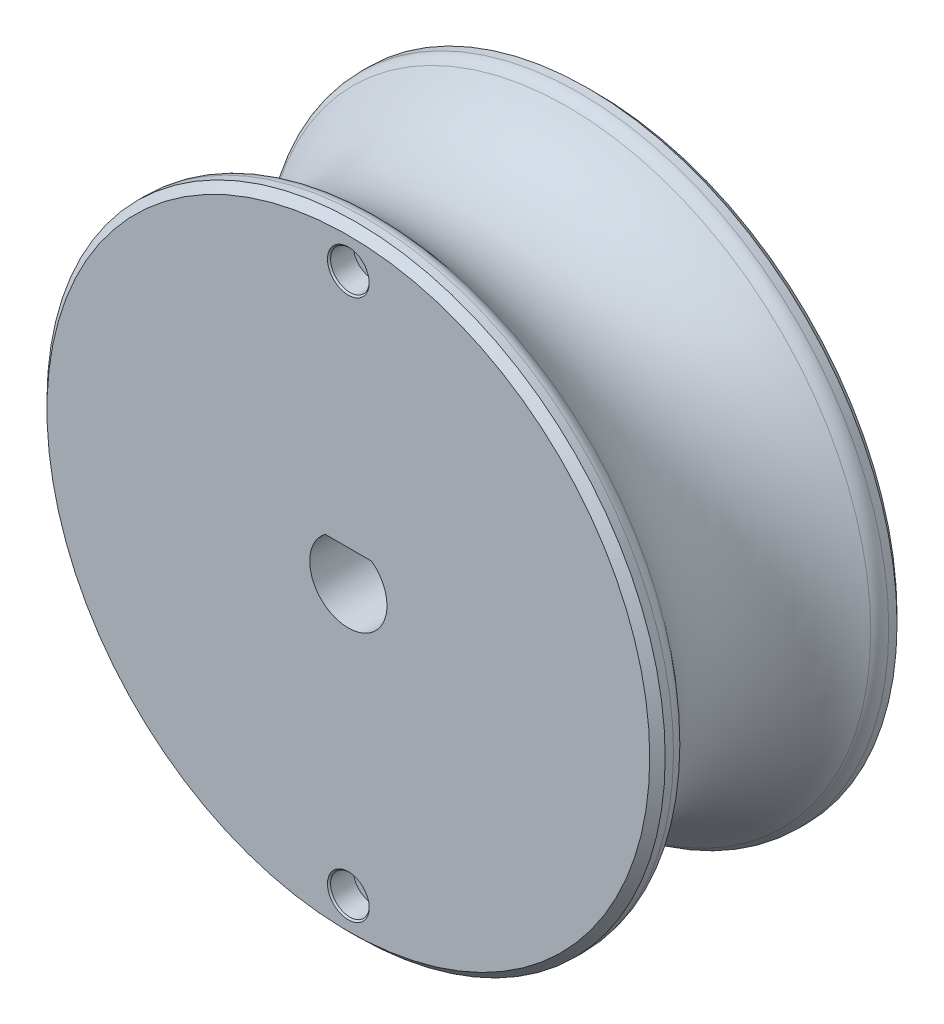
ISO-10303-21;
HEADER;
FILE_DESCRIPTION(('STEP AP214'),'2;1');
FILE_NAME('part.step','',(''),(''),'','','');
FILE_SCHEMA(('AUTOMOTIVE_DESIGN { 1 0 10303 214 1 1 1 1 }'));
ENDSEC;
DATA;
#1=APPLICATION_CONTEXT('core data for automotive mechanical design processes');
#2=APPLICATION_PROTOCOL_DEFINITION('international standard','automotive_design',2000,#1);
#3=PRODUCT_CONTEXT('',#1,'mechanical');
#4=PRODUCT('Part','Part','',(#3));
#5=PRODUCT_RELATED_PRODUCT_CATEGORY('part','',(#4));
#6=PRODUCT_DEFINITION_FORMATION('','',#4);
#7=PRODUCT_DEFINITION_CONTEXT('part definition',#1,'design');
#8=PRODUCT_DEFINITION('design','',#6,#7);
#9=PRODUCT_DEFINITION_SHAPE('','',#8);
#10=(LENGTH_UNIT() NAMED_UNIT(*) SI_UNIT(.MILLI.,.METRE.));
#11=(NAMED_UNIT(*) PLANE_ANGLE_UNIT() SI_UNIT($,.RADIAN.));
#12=(NAMED_UNIT(*) SI_UNIT($,.STERADIAN.) SOLID_ANGLE_UNIT());
#13=UNCERTAINTY_MEASURE_WITH_UNIT(LENGTH_MEASURE(1.E-05),#10,'distance_accuracy_value','');
#14=(GEOMETRIC_REPRESENTATION_CONTEXT(3) GLOBAL_UNCERTAINTY_ASSIGNED_CONTEXT((#13)) GLOBAL_UNIT_ASSIGNED_CONTEXT((#10,
#11,#12)) REPRESENTATION_CONTEXT('',''));
#15=CARTESIAN_POINT('',(0.,0.,0.));
#16=DIRECTION('',(0.,0.,1.));
#17=DIRECTION('',(1.,0.,0.));
#18=AXIS2_PLACEMENT_3D('',#15,#16,#17);
#19=CARTESIAN_POINT('',(0.,0.,20.32));
#20=DIRECTION('',(0.,0.,-1.));
#21=DIRECTION('',(-1.,0.,0.));
#22=AXIS2_PLACEMENT_3D('',#19,#20,#21);
#23=CYLINDRICAL_SURFACE('',#22,50.8);
#24=CARTESIAN_POINT('',(0.,0.,19.05));
#25=DIRECTION('',(0.,0.,1.));
#26=DIRECTION('',(1.,0.,0.));
#27=AXIS2_PLACEMENT_3D('',#24,#25,#26);
#28=CIRCLE('',#27,50.8);
#29=CARTESIAN_POINT('',(50.8,0.,19.05));
#30=VERTEX_POINT('',#29);
#31=EDGE_CURVE('E151',#30,#30,#28,.F.);
#32=ORIENTED_EDGE('',*,*,#31,.T.);
#33=EDGE_LOOP('',(#32));
#34=FACE_BOUND('',#33,.T.);
#35=CARTESIAN_POINT('',(0.,0.,17.6887167426018));
#36=DIRECTION('',(0.,0.,-1.));
#37=DIRECTION('',(-1.,0.,0.));
#38=AXIS2_PLACEMENT_3D('',#35,#36,#37);
#39=CIRCLE('',#38,50.8);
#40=CARTESIAN_POINT('',(-50.8,0.,17.6887167426018));
#41=VERTEX_POINT('',#40);
#42=EDGE_CURVE('E135',#41,#41,#39,.F.);
#43=ORIENTED_EDGE('',*,*,#42,.T.);
#44=EDGE_LOOP('',(#43));
#45=FACE_BOUND('',#44,.T.);
#46=ADVANCED_FACE('F49',(#34,#45),#23,.T.);
#47=CARTESIAN_POINT('',(0.,0.,20.32));
#48=DIRECTION('',(0.,0.,1.));
#49=DIRECTION('',(1.,0.,0.));
#50=AXIS2_PLACEMENT_3D('',#47,#48,#49);
#51=PLANE('',#50);
#52=CARTESIAN_POINT('',(0.,0.,20.32));
#53=DIRECTION('',(0.,0.,1.));
#54=DIRECTION('',(1.,0.,0.));
#55=AXIS2_PLACEMENT_3D('',#52,#53,#54);
#56=CIRCLE('',#55,6.35);
#57=CARTESIAN_POINT('',(-3.81,5.08,20.32));
#58=VERTEX_POINT('',#57);
#59=CARTESIAN_POINT('',(3.81,5.08,20.32));
#60=VERTEX_POINT('',#59);
#61=EDGE_CURVE('E12',#58,#60,#56,.T.);
#62=ORIENTED_EDGE('',*,*,#61,.F.);
#63=DIRECTION('',(-1.,0.,0.));
#64=VECTOR('',#63,1.);
#65=CARTESIAN_POINT('',(0.,5.08,20.32));
#66=LINE('',#65,#64);
#67=EDGE_CURVE('E59',#60,#58,#66,.T.);
#68=ORIENTED_EDGE('',*,*,#67,.F.);
#69=EDGE_LOOP('',(#62,#68));
#70=FACE_BOUND('',#69,.T.);
#71=CARTESIAN_POINT('',(0.,-44.45,20.32));
#72=DIRECTION('',(0.,0.,1.));
#73=DIRECTION('',(1.,0.,0.));
#74=AXIS2_PLACEMENT_3D('',#71,#72,#73);
#75=CIRCLE('',#74,3.42899999999999);
#76=CARTESIAN_POINT('',(3.42899999999999,-44.45,20.32));
#77=VERTEX_POINT('',#76);
#78=EDGE_CURVE('E163',#77,#77,#75,.F.);
#79=ORIENTED_EDGE('',*,*,#78,.T.);
#80=EDGE_LOOP('',(#79));
#81=FACE_BOUND('',#80,.T.);
#82=CARTESIAN_POINT('',(0.,44.45,20.32));
#83=DIRECTION('',(0.,0.,1.));
#84=DIRECTION('',(1.,0.,0.));
#85=AXIS2_PLACEMENT_3D('',#82,#83,#84);
#86=CIRCLE('',#85,3.42899999999997);
#87=CARTESIAN_POINT('',(3.42899999999997,44.45,20.32));
#88=VERTEX_POINT('',#87);
#89=EDGE_CURVE('E159',#88,#88,#86,.F.);
#90=ORIENTED_EDGE('',*,*,#89,.T.);
#91=EDGE_LOOP('',(#90));
#92=FACE_BOUND('',#91,.T.);
#93=CARTESIAN_POINT('',(0.,0.,20.32));
#94=DIRECTION('',(0.,0.,1.));
#95=DIRECTION('',(1.,0.,0.));
#96=AXIS2_PLACEMENT_3D('',#93,#94,#95);
#97=CIRCLE('',#96,49.53);
#98=CARTESIAN_POINT('',(49.53,0.,20.32));
#99=VERTEX_POINT('',#98);
#100=EDGE_CURVE('E139',#99,#99,#97,.T.);
#101=ORIENTED_EDGE('',*,*,#100,.T.);
#102=EDGE_LOOP('',(#101));
#103=FACE_BOUND('',#102,.T.);
#104=ADVANCED_FACE('F215',(#70,#81,#92,#103),#51,.T.);
#105=CARTESIAN_POINT('',(0.,0.,0.));
#106=DIRECTION('',(0.,0.,-1.));
#107=DIRECTION('',(-1.,0.,0.));
#108=AXIS2_PLACEMENT_3D('',#105,#106,#107);
#109=TOROIDAL_SURFACE('',#108,62.23,20.);
#110=CARTESIAN_POINT('',(0.,0.,-15.6954008363813));
#111=DIRECTION('',(0.,0.,1.));
#112=DIRECTION('',(1.,0.,0.));
#113=AXIS2_PLACEMENT_3D('',#110,#111,#112);
#114=CIRCLE('',#113,49.8342590949424);
#115=CARTESIAN_POINT('',(49.8342590949424,0.,-15.6954008363813));
#116=VERTEX_POINT('',#115);
#117=EDGE_CURVE('E131',#116,#116,#114,.T.);
#118=ORIENTED_EDGE('',*,*,#117,.T.);
#119=EDGE_LOOP('',(#118));
#120=FACE_BOUND('',#119,.T.);
#121=CARTESIAN_POINT('',(0.,0.,15.6954008363814));
#122=DIRECTION('',(0.,0.,-1.));
#123=DIRECTION('',(-1.,0.,0.));
#124=AXIS2_PLACEMENT_3D('',#121,#122,#123);
#125=CIRCLE('',#124,49.8342590949423);
#126=CARTESIAN_POINT('',(-49.8342590949423,0.,15.6954008363814));
#127=VERTEX_POINT('',#126);
#128=EDGE_CURVE('E127',#127,#127,#125,.T.);
#129=ORIENTED_EDGE('',*,*,#128,.T.);
#130=EDGE_LOOP('',(#129));
#131=FACE_BOUND('',#130,.T.);
#132=ADVANCED_FACE('F224',(#120,#131),#109,.F.);
#133=CARTESIAN_POINT('',(0.,0.,-20.32));
#134=DIRECTION('',(0.,0.,1.));
#135=DIRECTION('',(1.,0.,0.));
#136=AXIS2_PLACEMENT_3D('',#133,#134,#135);
#137=PLANE('',#136);
#138=CARTESIAN_POINT('',(0.,44.45,-20.32));
#139=DIRECTION('',(0.,0.,-1.));
#140=DIRECTION('',(1.,0.,0.));
#141=AXIS2_PLACEMENT_3D('',#138,#139,#140);
#142=CIRCLE('',#141,3.175);
#143=CARTESIAN_POINT('',(3.175,44.45,-20.32));
#144=VERTEX_POINT('',#143);
#145=EDGE_CURVE('E91',#144,#144,#142,.T.);
#146=ORIENTED_EDGE('',*,*,#145,.F.);
#147=EDGE_LOOP('',(#146));
#148=FACE_BOUND('',#147,.T.);
#149=CARTESIAN_POINT('',(0.,-44.45,-20.32));
#150=DIRECTION('',(0.,0.,1.));
#151=DIRECTION('',(1.,0.,0.));
#152=AXIS2_PLACEMENT_3D('',#149,#150,#151);
#153=CIRCLE('',#152,3.175);
#154=CARTESIAN_POINT('',(3.175,-44.45,-20.32));
#155=VERTEX_POINT('',#154);
#156=EDGE_CURVE('E101',#155,#155,#153,.T.);
#157=ORIENTED_EDGE('',*,*,#156,.T.);
#158=EDGE_LOOP('',(#157));
#159=FACE_BOUND('',#158,.T.);
#160=CARTESIAN_POINT('',(0.,0.,-20.32));
#161=DIRECTION('',(0.,0.,1.));
#162=DIRECTION('',(1.,0.,0.));
#163=AXIS2_PLACEMENT_3D('',#160,#161,#162);
#164=CIRCLE('',#163,5.01649999999999);
#165=CARTESIAN_POINT('',(5.01649999999999,0.,-20.32));
#166=VERTEX_POINT('',#165);
#167=EDGE_CURVE('E178',#166,#166,#164,.T.);
#168=ORIENTED_EDGE('',*,*,#167,.T.);
#169=EDGE_LOOP('',(#168));
#170=FACE_BOUND('',#169,.T.);
#171=CARTESIAN_POINT('',(0.,0.,-20.32));
#172=DIRECTION('',(0.,0.,1.));
#173=DIRECTION('',(1.,0.,0.));
#174=AXIS2_PLACEMENT_3D('',#171,#172,#173);
#175=CIRCLE('',#174,49.53);
#176=CARTESIAN_POINT('',(49.53,0.,-20.32));
#177=VERTEX_POINT('',#176);
#178=EDGE_CURVE('E147',#177,#177,#175,.F.);
#179=ORIENTED_EDGE('',*,*,#178,.T.);
#180=EDGE_LOOP('',(#179));
#181=FACE_BOUND('',#180,.T.);
#182=ADVANCED_FACE('F231',(#148,#159,#170,#181),#137,.F.);
#183=CARTESIAN_POINT('',(0.,0.,-19.05));
#184=DIRECTION('',(0.,0.,1.));
#185=DIRECTION('',(1.,0.,0.));
#186=AXIS2_PLACEMENT_3D('',#183,#184,#185);
#187=CIRCLE('',#186,50.8);
#188=CARTESIAN_POINT('',(50.8,0.,-19.05));
#189=VERTEX_POINT('',#188);
#190=EDGE_CURVE('E143',#189,#189,#187,.T.);
#191=ORIENTED_EDGE('',*,*,#190,.T.);
#192=EDGE_LOOP('',(#191));
#193=FACE_BOUND('',#192,.T.);
#194=CARTESIAN_POINT('',(0.,0.,-17.6887167426018));
#195=DIRECTION('',(0.,0.,1.));
#196=DIRECTION('',(1.,0.,0.));
#197=AXIS2_PLACEMENT_3D('',#194,#195,#196);
#198=CIRCLE('',#197,50.8);
#199=CARTESIAN_POINT('',(50.8,0.,-17.6887167426018));
#200=VERTEX_POINT('',#199);
#201=EDGE_CURVE('E123',#200,#200,#198,.F.);
#202=ORIENTED_EDGE('',*,*,#201,.T.);
#203=EDGE_LOOP('',(#202));
#204=FACE_BOUND('',#203,.T.);
#205=ADVANCED_FACE('F218',(#193,#204),#23,.T.);
#206=CARTESIAN_POINT('',(0.,0.,-17.6887167426018));
#207=DIRECTION('',(0.,0.,1.));
#208=DIRECTION('',(1.,0.,0.));
#209=AXIS2_PLACEMENT_3D('',#206,#207,#208);
#210=TOROIDAL_SURFACE('',#209,48.26,2.54);
#211=ORIENTED_EDGE('',*,*,#117,.F.);
#212=EDGE_LOOP('',(#211));
#213=FACE_BOUND('',#212,.T.);
#214=ORIENTED_EDGE('',*,*,#201,.F.);
#215=EDGE_LOOP('',(#214));
#216=FACE_BOUND('',#215,.T.);
#217=ADVANCED_FACE('F230',(#213,#216),#210,.T.);
#218=CARTESIAN_POINT('',(0.,0.,17.6887167426018));
#219=DIRECTION('',(0.,0.,-1.));
#220=DIRECTION('',(-1.,0.,0.));
#221=AXIS2_PLACEMENT_3D('',#218,#219,#220);
#222=TOROIDAL_SURFACE('',#221,48.26,2.54);
#223=ORIENTED_EDGE('',*,*,#128,.F.);
#224=EDGE_LOOP('',(#223));
#225=FACE_BOUND('',#224,.T.);
#226=ORIENTED_EDGE('',*,*,#42,.F.);
#227=EDGE_LOOP('',(#226));
#228=FACE_BOUND('',#227,.T.);
#229=ADVANCED_FACE('F237',(#225,#228),#222,.T.);
#230=CARTESIAN_POINT('',(0.,0.,-19.05));
#231=DIRECTION('',(0.,0.,1.));
#232=DIRECTION('',(1.,0.,0.));
#233=AXIS2_PLACEMENT_3D('',#230,#231,#232);
#234=CONICAL_SURFACE('',#233,50.8,0.785398163397446);
#235=ORIENTED_EDGE('',*,*,#178,.F.);
#236=EDGE_LOOP('',(#235));
#237=FACE_BOUND('',#236,.T.);
#238=ORIENTED_EDGE('',*,*,#190,.F.);
#239=EDGE_LOOP('',(#238));
#240=FACE_BOUND('',#239,.T.);
#241=ADVANCED_FACE('F246',(#237,#240),#234,.T.);
#242=CARTESIAN_POINT('',(0.,0.,20.32));
#243=DIRECTION('',(0.,0.,-1.));
#244=DIRECTION('',(-1.,0.,0.));
#245=AXIS2_PLACEMENT_3D('',#242,#243,#244);
#246=CONICAL_SURFACE('',#245,49.53,0.785398163397451);
#247=ORIENTED_EDGE('',*,*,#31,.F.);
#248=EDGE_LOOP('',(#247));
#249=FACE_BOUND('',#248,.T.);
#250=ORIENTED_EDGE('',*,*,#100,.F.);
#251=EDGE_LOOP('',(#250));
#252=FACE_BOUND('',#251,.T.);
#253=ADVANCED_FACE('F247',(#249,#252),#246,.T.);
#254=CARTESIAN_POINT('',(0.,-44.45,16.32));
#255=DIRECTION('',(0.,0.,1.));
#256=DIRECTION('',(1.,0.,0.));
#257=AXIS2_PLACEMENT_3D('',#254,#255,#256);
#258=CYLINDRICAL_SURFACE('',#257,3.175);
#259=CARTESIAN_POINT('',(0.,-44.45,20.066));
#260=DIRECTION('',(0.,0.,1.));
#261=DIRECTION('',(1.,0.,0.));
#262=AXIS2_PLACEMENT_3D('',#259,#260,#261);
#263=CIRCLE('',#262,3.175);
#264=CARTESIAN_POINT('',(3.175,-44.45,20.066));
#265=VERTEX_POINT('',#264);
#266=EDGE_CURVE('E155',#265,#265,#263,.T.);
#267=ORIENTED_EDGE('',*,*,#266,.T.);
#268=EDGE_LOOP('',(#267));
#269=FACE_BOUND('',#268,.T.);
#270=CARTESIAN_POINT('',(0.,-44.45,16.32));
#271=DIRECTION('',(0.,0.,1.));
#272=DIRECTION('',(1.,0.,0.));
#273=AXIS2_PLACEMENT_3D('',#270,#271,#272);
#274=CIRCLE('',#273,3.175);
#275=CARTESIAN_POINT('',(3.175,-44.45,16.32));
#276=VERTEX_POINT('',#275);
#277=EDGE_CURVE('E119',#276,#276,#274,.T.);
#278=ORIENTED_EDGE('',*,*,#277,.F.);
#279=EDGE_LOOP('',(#278));
#280=FACE_BOUND('',#279,.T.);
#281=ADVANCED_FACE('F253',(#269,#280),#258,.F.);
#282=CARTESIAN_POINT('',(0.,-44.45,16.32));
#283=DIRECTION('',(0.,0.,1.));
#284=DIRECTION('',(1.,0.,0.));
#285=AXIS2_PLACEMENT_3D('',#282,#283,#284);
#286=PLANE('',#285);
#287=ORIENTED_EDGE('',*,*,#277,.T.);
#288=EDGE_LOOP('',(#287));
#289=FACE_BOUND('',#288,.T.);
#290=ADVANCED_FACE('F328',(#289),#286,.T.);
#291=CARTESIAN_POINT('',(0.,44.45,16.32));
#292=DIRECTION('',(0.,0.,1.));
#293=DIRECTION('',(1.,0.,0.));
#294=AXIS2_PLACEMENT_3D('',#291,#292,#293);
#295=CYLINDRICAL_SURFACE('',#294,3.175);
#296=CARTESIAN_POINT('',(0.,44.45,20.066));
#297=DIRECTION('',(0.,0.,1.));
#298=DIRECTION('',(1.,0.,0.));
#299=AXIS2_PLACEMENT_3D('',#296,#297,#298);
#300=CIRCLE('',#299,3.175);
#301=CARTESIAN_POINT('',(3.175,44.45,20.066));
#302=VERTEX_POINT('',#301);
#303=EDGE_CURVE('E167',#302,#302,#300,.T.);
#304=ORIENTED_EDGE('',*,*,#303,.T.);
#305=EDGE_LOOP('',(#304));
#306=FACE_BOUND('',#305,.T.);
#307=CARTESIAN_POINT('',(0.,44.45,16.32));
#308=DIRECTION('',(0.,0.,-1.));
#309=DIRECTION('',(1.,0.,0.));
#310=AXIS2_PLACEMENT_3D('',#307,#308,#309);
#311=CIRCLE('',#310,3.175);
#312=CARTESIAN_POINT('',(3.175,44.45,16.32));
#313=VERTEX_POINT('',#312);
#314=EDGE_CURVE('E115',#313,#313,#311,.T.);
#315=ORIENTED_EDGE('',*,*,#314,.T.);
#316=EDGE_LOOP('',(#315));
#317=FACE_BOUND('',#316,.T.);
#318=ADVANCED_FACE('F332',(#306,#317),#295,.F.);
#319=CARTESIAN_POINT('',(0.,44.45,16.32));
#320=DIRECTION('',(0.,0.,1.));
#321=DIRECTION('',(1.,0.,0.));
#322=AXIS2_PLACEMENT_3D('',#319,#320,#321);
#323=PLANE('',#322);
#324=ORIENTED_EDGE('',*,*,#314,.F.);
#325=EDGE_LOOP('',(#324));
#326=FACE_BOUND('',#325,.T.);
#327=ADVANCED_FACE('F274',(#326),#323,.T.);
#328=CARTESIAN_POINT('',(0.,-44.45,20.066));
#329=DIRECTION('',(0.,0.,1.));
#330=DIRECTION('',(1.,0.,0.));
#331=AXIS2_PLACEMENT_3D('',#328,#329,#330);
#332=CONICAL_SURFACE('',#331,3.175,0.785398163397418);
#333=ORIENTED_EDGE('',*,*,#78,.F.);
#334=EDGE_LOOP('',(#333));
#335=FACE_BOUND('',#334,.T.);
#336=ORIENTED_EDGE('',*,*,#266,.F.);
#337=EDGE_LOOP('',(#336));
#338=FACE_BOUND('',#337,.T.);
#339=ADVANCED_FACE('F267',(#335,#338),#332,.F.);
#340=CARTESIAN_POINT('',(0.,44.45,20.32));
#341=DIRECTION('',(0.,0.,1.));
#342=DIRECTION('',(1.,0.,0.));
#343=AXIS2_PLACEMENT_3D('',#340,#341,#342);
#344=CONICAL_SURFACE('',#343,3.42899999999997,0.785398163397445);
#345=ORIENTED_EDGE('',*,*,#303,.F.);
#346=EDGE_LOOP('',(#345));
#347=FACE_BOUND('',#346,.T.);
#348=ORIENTED_EDGE('',*,*,#89,.F.);
#349=EDGE_LOOP('',(#348));
#350=FACE_BOUND('',#349,.T.);
#351=ADVANCED_FACE('F273',(#347,#350),#344,.F.);
#352=CARTESIAN_POINT('',(0.,0.,-42.6803841816037));
#353=DIRECTION('',(0.,0.,1.));
#354=DIRECTION('',(1.,0.,0.));
#355=AXIS2_PLACEMENT_3D('',#352,#353,#354);
#356=CYLINDRICAL_SURFACE('',#355,4.7625);
#357=CARTESIAN_POINT('',(0.,0.,-20.574));
#358=DIRECTION('',(0.,0.,1.));
#359=DIRECTION('',(1.,0.,0.));
#360=AXIS2_PLACEMENT_3D('',#357,#358,#359);
#361=CIRCLE('',#360,4.7625);
#362=CARTESIAN_POINT('',(4.7625,0.,-20.574));
#363=VERTEX_POINT('',#362);
#364=EDGE_CURVE('E171',#363,#363,#361,.F.);
#365=ORIENTED_EDGE('',*,*,#364,.T.);
#366=EDGE_LOOP('',(#365));
#367=FACE_BOUND('',#366,.T.);
#368=CARTESIAN_POINT('',(0.,0.,-21.21));
#369=DIRECTION('',(0.,0.,-1.));
#370=DIRECTION('',(-1.,0.,0.));
#371=AXIS2_PLACEMENT_3D('',#368,#369,#370);
#372=CIRCLE('',#371,4.7625);
#373=CARTESIAN_POINT('',(-4.7625,0.,-21.21));
#374=VERTEX_POINT('',#373);
#375=EDGE_CURVE('E107',#374,#374,#372,.T.);
#376=ORIENTED_EDGE('',*,*,#375,.F.);
#377=EDGE_LOOP('',(#376));
#378=FACE_BOUND('',#377,.T.);
#379=ADVANCED_FACE('F211',(#367,#378),#356,.T.);
#380=CARTESIAN_POINT('',(0.,0.,-21.21));
#381=DIRECTION('',(0.,0.,-1.));
#382=DIRECTION('',(-1.,0.,0.));
#383=AXIS2_PLACEMENT_3D('',#380,#381,#382);
#384=PLANE('',#383);
#385=CARTESIAN_POINT('',(0.,0.,-21.21));
#386=DIRECTION('',(0.,0.,-1.));
#387=DIRECTION('',(-1.,0.,0.));
#388=AXIS2_PLACEMENT_3D('',#385,#386,#387);
#389=CIRCLE('',#388,3.95);
#390=CARTESIAN_POINT('',(-3.95,0.,-21.21));
#391=VERTEX_POINT('',#390);
#392=EDGE_CURVE('E114',#391,#391,#389,.T.);
#393=ORIENTED_EDGE('',*,*,#392,.F.);
#394=EDGE_LOOP('',(#393));
#395=FACE_BOUND('',#394,.T.);
#396=ORIENTED_EDGE('',*,*,#375,.T.);
#397=EDGE_LOOP('',(#396));
#398=FACE_BOUND('',#397,.T.);
#399=ADVANCED_FACE('F203',(#395,#398),#384,.T.);
#400=CARTESIAN_POINT('',(0.,0.,-29.21));
#401=DIRECTION('',(0.,0.,-1.));
#402=DIRECTION('',(-1.,0.,0.));
#403=AXIS2_PLACEMENT_3D('',#400,#401,#402);
#404=PLANE('',#403);
#405=CARTESIAN_POINT('',(0.,0.,-29.21));
#406=DIRECTION('',(0.,0.,-1.));
#407=DIRECTION('',(-1.,0.,0.));
#408=AXIS2_PLACEMENT_3D('',#405,#406,#407);
#409=CIRCLE('',#408,3.69599999999999);
#410=CARTESIAN_POINT('',(-3.69599999999999,0.,-29.21));
#411=VERTEX_POINT('',#410);
#412=EDGE_CURVE('E182',#411,#411,#409,.T.);
#413=ORIENTED_EDGE('',*,*,#412,.T.);
#414=EDGE_LOOP('',(#413));
#415=FACE_BOUND('',#414,.T.);
#416=ADVANCED_FACE('F201',(#415),#404,.T.);
#417=CARTESIAN_POINT('',(0.,0.,-29.21));
#418=DIRECTION('',(0.,0.,1.));
#419=DIRECTION('',(1.,0.,0.));
#420=AXIS2_PLACEMENT_3D('',#417,#418,#419);
#421=CYLINDRICAL_SURFACE('',#420,3.95);
#422=CARTESIAN_POINT('',(0.,0.,-28.956));
#423=DIRECTION('',(0.,0.,-1.));
#424=DIRECTION('',(-1.,0.,0.));
#425=AXIS2_PLACEMENT_3D('',#422,#423,#424);
#426=CIRCLE('',#425,3.95);
#427=CARTESIAN_POINT('',(-3.95,0.,-28.956));
#428=VERTEX_POINT('',#427);
#429=EDGE_CURVE('E186',#428,#428,#426,.F.);
#430=ORIENTED_EDGE('',*,*,#429,.T.);
#431=EDGE_LOOP('',(#430));
#432=FACE_BOUND('',#431,.T.);
#433=ORIENTED_EDGE('',*,*,#392,.T.);
#434=EDGE_LOOP('',(#433));
#435=FACE_BOUND('',#434,.T.);
#436=ADVANCED_FACE('F192',(#432,#435),#421,.T.);
#437=CARTESIAN_POINT('',(0.,0.,-20.574));
#438=DIRECTION('',(0.,0.,1.));
#439=DIRECTION('',(1.,0.,0.));
#440=AXIS2_PLACEMENT_3D('',#437,#438,#439);
#441=CONICAL_SURFACE('',#440,4.7625,0.785398163397481);
#442=ORIENTED_EDGE('',*,*,#167,.F.);
#443=EDGE_LOOP('',(#442));
#444=FACE_BOUND('',#443,.T.);
#445=ORIENTED_EDGE('',*,*,#364,.F.);
#446=EDGE_LOOP('',(#445));
#447=FACE_BOUND('',#446,.T.);
#448=ADVANCED_FACE('F198',(#444,#447),#441,.T.);
#449=CARTESIAN_POINT('',(0.,0.,-29.21));
#450=DIRECTION('',(0.,0.,1.));
#451=DIRECTION('',(1.,0.,0.));
#452=AXIS2_PLACEMENT_3D('',#449,#450,#451);
#453=CONICAL_SURFACE('',#452,3.69599999999999,0.785398163397472);
#454=ORIENTED_EDGE('',*,*,#429,.F.);
#455=EDGE_LOOP('',(#454));
#456=FACE_BOUND('',#455,.T.);
#457=ORIENTED_EDGE('',*,*,#412,.F.);
#458=EDGE_LOOP('',(#457));
#459=FACE_BOUND('',#458,.T.);
#460=ADVANCED_FACE('F52',(#456,#459),#453,.T.);
#461=CARTESIAN_POINT('',(0.,-44.45,-16.32));
#462=DIRECTION('',(0.,0.,-1.));
#463=DIRECTION('',(-1.,0.,0.));
#464=AXIS2_PLACEMENT_3D('',#461,#462,#463);
#465=CYLINDRICAL_SURFACE('',#464,3.175);
#466=CARTESIAN_POINT('',(0.,-44.45,-16.32));
#467=DIRECTION('',(0.,0.,1.));
#468=DIRECTION('',(1.,0.,0.));
#469=AXIS2_PLACEMENT_3D('',#466,#467,#468);
#470=CIRCLE('',#469,3.175);
#471=CARTESIAN_POINT('',(3.175,-44.45,-16.32));
#472=VERTEX_POINT('',#471);
#473=EDGE_CURVE('E103',#472,#472,#470,.T.);
#474=ORIENTED_EDGE('',*,*,#473,.T.);
#475=EDGE_LOOP('',(#474));
#476=FACE_BOUND('',#475,.T.);
#477=ORIENTED_EDGE('',*,*,#156,.F.);
#478=EDGE_LOOP('',(#477));
#479=FACE_BOUND('',#478,.T.);
#480=ADVANCED_FACE('F197',(#476,#479),#465,.F.);
#481=CARTESIAN_POINT('',(0.,-44.45,-16.32));
#482=DIRECTION('',(0.,0.,-1.));
#483=DIRECTION('',(1.,0.,0.));
#484=AXIS2_PLACEMENT_3D('',#481,#482,#483);
#485=PLANE('',#484);
#486=ORIENTED_EDGE('',*,*,#473,.F.);
#487=EDGE_LOOP('',(#486));
#488=FACE_BOUND('',#487,.T.);
#489=ADVANCED_FACE('F300',(#488),#485,.T.);
#490=CARTESIAN_POINT('',(0.,44.45,-16.32));
#491=DIRECTION('',(0.,0.,-1.));
#492=DIRECTION('',(-1.,0.,0.));
#493=AXIS2_PLACEMENT_3D('',#490,#491,#492);
#494=CYLINDRICAL_SURFACE('',#493,3.175);
#495=CARTESIAN_POINT('',(0.,44.45,-16.32));
#496=DIRECTION('',(0.,0.,-1.));
#497=DIRECTION('',(1.,0.,0.));
#498=AXIS2_PLACEMENT_3D('',#495,#496,#497);
#499=CIRCLE('',#498,3.175);
#500=CARTESIAN_POINT('',(3.175,44.45,-16.32));
#501=VERTEX_POINT('',#500);
#502=EDGE_CURVE('E95',#501,#501,#499,.T.);
#503=ORIENTED_EDGE('',*,*,#502,.F.);
#504=EDGE_LOOP('',(#503));
#505=FACE_BOUND('',#504,.T.);
#506=ORIENTED_EDGE('',*,*,#145,.T.);
#507=EDGE_LOOP('',(#506));
#508=FACE_BOUND('',#507,.T.);
#509=ADVANCED_FACE('F304',(#505,#508),#494,.F.);
#510=CARTESIAN_POINT('',(0.,44.45,-16.32));
#511=DIRECTION('',(0.,0.,-1.));
#512=DIRECTION('',(1.,0.,0.));
#513=AXIS2_PLACEMENT_3D('',#510,#511,#512);
#514=PLANE('',#513);
#515=ORIENTED_EDGE('',*,*,#502,.T.);
#516=EDGE_LOOP('',(#515));
#517=FACE_BOUND('',#516,.T.);
#518=ADVANCED_FACE('F308',(#517),#514,.T.);
#519=CARTESIAN_POINT('',(0.,0.,-10.7661025397836));
#520=DIRECTION('',(0.,0.,1.));
#521=DIRECTION('',(1.,0.,0.));
#522=AXIS2_PLACEMENT_3D('',#519,#520,#521);
#523=CYLINDRICAL_SURFACE('',#522,6.35);
#524=ORIENTED_EDGE('',*,*,#61,.T.);
#525=DIRECTION('',(0.,0.,1.));
#526=VECTOR('',#525,1.);
#527=CARTESIAN_POINT('',(3.81,5.08,-10.7661025397836));
#528=LINE('',#527,#526);
#529=CARTESIAN_POINT('',(3.81,5.08,6.32));
#530=VERTEX_POINT('',#529);
#531=EDGE_CURVE('E66',#530,#60,#528,.T.);
#532=ORIENTED_EDGE('',*,*,#531,.F.);
#533=CARTESIAN_POINT('',(0.,0.,6.32));
#534=DIRECTION('',(0.,0.,1.));
#535=DIRECTION('',(1.,0.,0.));
#536=AXIS2_PLACEMENT_3D('',#533,#534,#535);
#537=CIRCLE('',#536,6.35);
#538=CARTESIAN_POINT('',(-3.81,5.08,6.32));
#539=VERTEX_POINT('',#538);
#540=EDGE_CURVE('E77',#530,#539,#537,.F.);
#541=ORIENTED_EDGE('',*,*,#540,.T.);
#542=DIRECTION('',(0.,0.,1.));
#543=VECTOR('',#542,1.);
#544=CARTESIAN_POINT('',(-3.81,5.08,-10.7661025397836));
#545=LINE('',#544,#543);
#546=EDGE_CURVE('E79',#539,#58,#545,.T.);
#547=ORIENTED_EDGE('',*,*,#546,.T.);
#548=EDGE_LOOP('',(#524,#532,#541,#547));
#549=FACE_BOUND('',#548,.T.);
#550=ADVANCED_FACE('F78',(#549),#523,.F.);
#551=CARTESIAN_POINT('',(-3.81,5.08,-10.7661025397836));
#552=DIRECTION('',(0.,1.,0.));
#553=DIRECTION('',(0.,0.,1.));
#554=AXIS2_PLACEMENT_3D('',#551,#552,#553);
#555=PLANE('',#554);
#556=ORIENTED_EDGE('',*,*,#67,.T.);
#557=ORIENTED_EDGE('',*,*,#546,.F.);
#558=DIRECTION('',(1.,0.,0.));
#559=VECTOR('',#558,1.);
#560=CARTESIAN_POINT('',(-3.81,5.08,6.32));
#561=LINE('',#560,#559);
#562=EDGE_CURVE('E84',#539,#530,#561,.T.);
#563=ORIENTED_EDGE('',*,*,#562,.T.);
#564=ORIENTED_EDGE('',*,*,#531,.T.);
#565=EDGE_LOOP('',(#556,#557,#563,#564));
#566=FACE_BOUND('',#565,.T.);
#567=ADVANCED_FACE('F86',(#566),#555,.F.);
#568=CARTESIAN_POINT('',(0.,0.,6.32));
#569=DIRECTION('',(0.,0.,1.));
#570=DIRECTION('',(1.,0.,0.));
#571=AXIS2_PLACEMENT_3D('',#568,#569,#570);
#572=PLANE('',#571);
#573=ORIENTED_EDGE('',*,*,#540,.F.);
#574=ORIENTED_EDGE('',*,*,#562,.F.);
#575=EDGE_LOOP('',(#573,#574));
#576=FACE_BOUND('',#575,.T.);
#577=ADVANCED_FACE('F89',(#576),#572,.T.);
#578=CLOSED_SHELL('',(#46,#104,#132,#182,#205,#217,#229,#241,#253,#281,#290,#318,#327,#339,#351,
#379,#399,#416,#436,#448,#460,#480,#489,#509,#518,#550,#567,#577));
#579=MANIFOLD_SOLID_BREP('B2',#578);
#580=ADVANCED_BREP_SHAPE_REPRESENTATION('',(#18,#579),#14);
#581=SHAPE_DEFINITION_REPRESENTATION(#9,#580);
ENDSEC;
END-ISO-10303-21;
